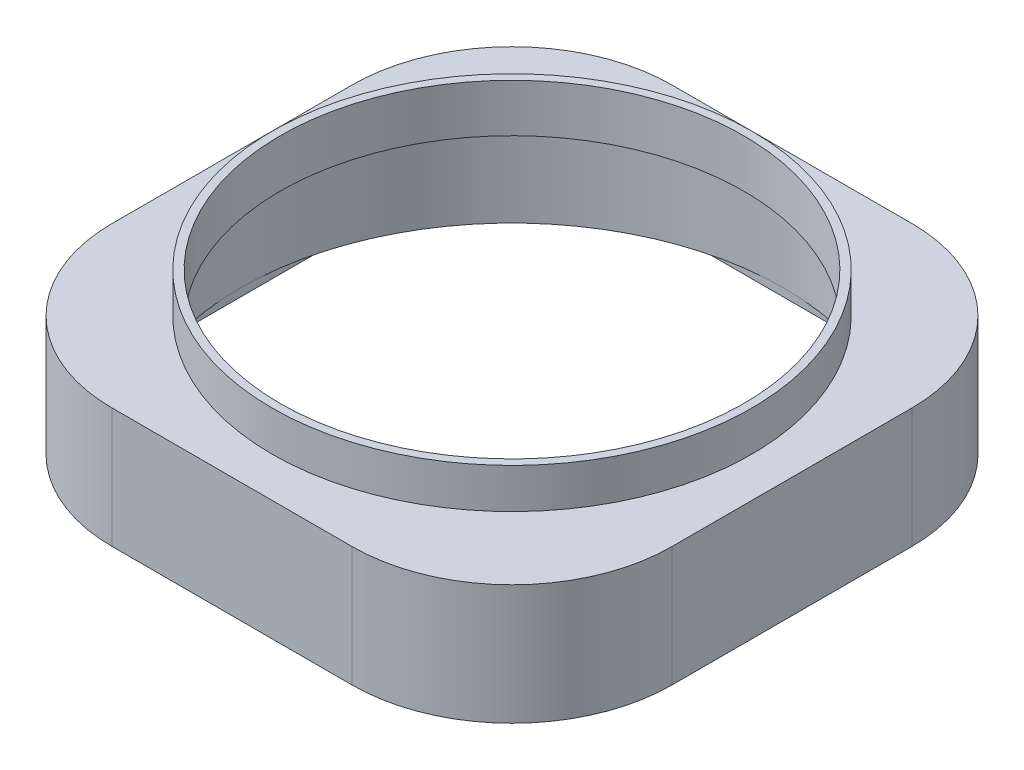
ISO-10303-21;
HEADER;
FILE_DESCRIPTION(('STEP AP214'),'2;1');
FILE_NAME('part.step','',(''),(''),'','','');
FILE_SCHEMA(('AUTOMOTIVE_DESIGN { 1 0 10303 214 1 1 1 1 }'));
ENDSEC;
DATA;
#1=APPLICATION_CONTEXT('core data for automotive mechanical design processes');
#2=APPLICATION_PROTOCOL_DEFINITION('international standard','automotive_design',2000,#1);
#3=PRODUCT_CONTEXT('',#1,'mechanical');
#4=PRODUCT('Part','Part','',(#3));
#5=PRODUCT_RELATED_PRODUCT_CATEGORY('part','',(#4));
#6=PRODUCT_DEFINITION_FORMATION('','',#4);
#7=PRODUCT_DEFINITION_CONTEXT('part definition',#1,'design');
#8=PRODUCT_DEFINITION('design','',#6,#7);
#9=PRODUCT_DEFINITION_SHAPE('','',#8);
#10=(LENGTH_UNIT() NAMED_UNIT(*) SI_UNIT(.MILLI.,.METRE.));
#11=(NAMED_UNIT(*) PLANE_ANGLE_UNIT() SI_UNIT($,.RADIAN.));
#12=(NAMED_UNIT(*) SI_UNIT($,.STERADIAN.) SOLID_ANGLE_UNIT());
#13=UNCERTAINTY_MEASURE_WITH_UNIT(LENGTH_MEASURE(1.E-05),#10,'distance_accuracy_value','');
#14=(GEOMETRIC_REPRESENTATION_CONTEXT(3) GLOBAL_UNCERTAINTY_ASSIGNED_CONTEXT((#13)) GLOBAL_UNIT_ASSIGNED_CONTEXT((#10,
#11,#12)) REPRESENTATION_CONTEXT('',''));
#15=CARTESIAN_POINT('',(0.,0.,0.));
#16=DIRECTION('',(0.,0.,1.));
#17=DIRECTION('',(1.,0.,0.));
#18=AXIS2_PLACEMENT_3D('',#15,#16,#17);
#19=CARTESIAN_POINT('',(0.,-2.00000000000007,0.));
#20=DIRECTION('',(0.,-1.,0.));
#21=DIRECTION('',(0.,0.,-1.));
#22=AXIS2_PLACEMENT_3D('',#19,#20,#21);
#23=CYLINDRICAL_SURFACE('',#22,68.);
#24=CARTESIAN_POINT('',(0.,-2.00000000000007,0.));
#25=DIRECTION('',(0.,-1.,0.));
#26=DIRECTION('',(0.,0.,-1.));
#27=AXIS2_PLACEMENT_3D('',#24,#25,#26);
#28=CIRCLE('',#27,68.);
#29=CARTESIAN_POINT('',(0.,-2.00000000000007,-68.));
#30=VERTEX_POINT('',#29);
#31=EDGE_CURVE('E253',#30,#30,#28,.T.);
#32=ORIENTED_EDGE('',*,*,#31,.F.);
#33=EDGE_LOOP('',(#32));
#34=FACE_BOUND('',#33,.T.);
#35=CARTESIAN_POINT('',(0.,-28.,0.));
#36=DIRECTION('',(0.,-1.,0.));
#37=DIRECTION('',(0.,0.,-1.));
#38=AXIS2_PLACEMENT_3D('',#35,#36,#37);
#39=CIRCLE('',#38,68.);
#40=CARTESIAN_POINT('',(0.,-28.,-67.9999999999997));
#41=VERTEX_POINT('',#40);
#42=CARTESIAN_POINT('',(-67.9999999999999,-28.,7.70679816260629E-13));
#43=VERTEX_POINT('',#42);
#44=EDGE_CURVE('E11',#41,#43,#39,.F.);
#45=ORIENTED_EDGE('',*,*,#44,.F.);
#46=CARTESIAN_POINT('',(67.9999999999999,-28.,-1.25825276124184E-13));
#47=VERTEX_POINT('',#46);
#48=EDGE_CURVE('E37',#47,#41,#39,.F.);
#49=ORIENTED_EDGE('',*,*,#48,.F.);
#50=CARTESIAN_POINT('',(0.,-28.,68.));
#51=VERTEX_POINT('',#50);
#52=EDGE_CURVE('E329',#51,#47,#39,.F.);
#53=ORIENTED_EDGE('',*,*,#52,.F.);
#54=EDGE_CURVE('E42',#43,#51,#39,.F.);
#55=ORIENTED_EDGE('',*,*,#54,.F.);
#56=EDGE_LOOP('',(#45,#49,#53,#55));
#57=FACE_BOUND('',#56,.T.);
#58=ADVANCED_FACE('F33',(#34,#57),#23,.F.);
#59=CARTESIAN_POINT('',(-30.,-40.,30.));
#60=DIRECTION('',(0.,1.,0.));
#61=DIRECTION('',(0.,0.,1.));
#62=AXIS2_PLACEMENT_3D('',#59,#60,#61);
#63=CYLINDRICAL_SURFACE('',#62,40.);
#64=DIRECTION('',(0.,1.,0.));
#65=VECTOR('',#64,1.);
#66=CARTESIAN_POINT('',(-70.,-40.,29.9999999999997));
#67=LINE('',#66,#65);
#68=CARTESIAN_POINT('',(-70.,-30.,29.9999999999997));
#69=VERTEX_POINT('',#68);
#70=CARTESIAN_POINT('',(-70.,0.,29.9999999999997));
#71=VERTEX_POINT('',#70);
#72=EDGE_CURVE('E270',#69,#71,#67,.T.);
#73=ORIENTED_EDGE('',*,*,#72,.F.);
#74=CARTESIAN_POINT('',(-30.,-30.,30.));
#75=DIRECTION('',(0.,-1.,0.));
#76=DIRECTION('',(0.,0.,-1.));
#77=AXIS2_PLACEMENT_3D('',#74,#75,#76);
#78=CIRCLE('',#77,40.);
#79=CARTESIAN_POINT('',(-29.9999999999997,-30.,70.));
#80=VERTEX_POINT('',#79);
#81=EDGE_CURVE('E250',#69,#80,#78,.F.);
#82=ORIENTED_EDGE('',*,*,#81,.T.);
#83=DIRECTION('',(0.,1.,0.));
#84=VECTOR('',#83,1.);
#85=CARTESIAN_POINT('',(-29.9999999999997,-40.,70.));
#86=LINE('',#85,#84);
#87=CARTESIAN_POINT('',(-29.9999999999997,0.,70.));
#88=VERTEX_POINT('',#87);
#89=EDGE_CURVE('E294',#80,#88,#86,.T.);
#90=ORIENTED_EDGE('',*,*,#89,.T.);
#91=CARTESIAN_POINT('',(-30.,0.,30.));
#92=DIRECTION('',(0.,1.,0.));
#93=DIRECTION('',(0.,0.,-1.));
#94=AXIS2_PLACEMENT_3D('',#91,#92,#93);
#95=CIRCLE('',#94,40.);
#96=EDGE_CURVE('E265',#71,#88,#95,.T.);
#97=ORIENTED_EDGE('',*,*,#96,.F.);
#98=EDGE_LOOP('',(#73,#82,#90,#97));
#99=FACE_BOUND('',#98,.T.);
#100=ADVANCED_FACE('F35',(#99),#63,.T.);
#101=CARTESIAN_POINT('',(-70.,-40.,-29.9999999999997));
#102=DIRECTION('',(-1.,0.,0.));
#103=DIRECTION('',(0.,0.,1.));
#104=AXIS2_PLACEMENT_3D('',#101,#102,#103);
#105=PLANE('',#104);
#106=DIRECTION('',(0.,1.,0.));
#107=VECTOR('',#106,1.);
#108=CARTESIAN_POINT('',(-70.,-40.,-29.9999999999997));
#109=LINE('',#108,#107);
#110=CARTESIAN_POINT('',(-70.,-30.,-29.9999999999997));
#111=VERTEX_POINT('',#110);
#112=CARTESIAN_POINT('',(-70.,0.,-29.9999999999997));
#113=VERTEX_POINT('',#112);
#114=EDGE_CURVE('E296',#111,#113,#109,.T.);
#115=ORIENTED_EDGE('',*,*,#114,.F.);
#116=DIRECTION('',(0.,0.,1.));
#117=VECTOR('',#116,1.);
#118=CARTESIAN_POINT('',(-70.,-30.,-29.9999999999997));
#119=LINE('',#118,#117);
#120=EDGE_CURVE('E247',#111,#69,#119,.T.);
#121=ORIENTED_EDGE('',*,*,#120,.T.);
#122=ORIENTED_EDGE('',*,*,#72,.T.);
#123=DIRECTION('',(0.,0.,1.));
#124=VECTOR('',#123,1.);
#125=CARTESIAN_POINT('',(-70.,0.,-29.9999999999997));
#126=LINE('',#125,#124);
#127=EDGE_CURVE('E291',#113,#71,#126,.T.);
#128=ORIENTED_EDGE('',*,*,#127,.F.);
#129=EDGE_LOOP('',(#115,#121,#122,#128));
#130=FACE_BOUND('',#129,.T.);
#131=ADVANCED_FACE('F350',(#130),#105,.T.);
#132=CARTESIAN_POINT('',(-30.,-40.,-30.));
#133=DIRECTION('',(0.,1.,0.));
#134=DIRECTION('',(0.,0.,1.));
#135=AXIS2_PLACEMENT_3D('',#132,#133,#134);
#136=CYLINDRICAL_SURFACE('',#135,40.);
#137=DIRECTION('',(0.,1.,0.));
#138=VECTOR('',#137,1.);
#139=CARTESIAN_POINT('',(-29.9999999999997,-40.,-70.));
#140=LINE('',#139,#138);
#141=CARTESIAN_POINT('',(-29.9999999999997,-30.,-70.));
#142=VERTEX_POINT('',#141);
#143=CARTESIAN_POINT('',(-29.9999999999997,0.,-70.));
#144=VERTEX_POINT('',#143);
#145=EDGE_CURVE('E298',#142,#144,#140,.T.);
#146=ORIENTED_EDGE('',*,*,#145,.F.);
#147=CARTESIAN_POINT('',(-30.,-30.,-30.));
#148=DIRECTION('',(0.,-1.,0.));
#149=DIRECTION('',(0.,0.,-1.));
#150=AXIS2_PLACEMENT_3D('',#147,#148,#149);
#151=CIRCLE('',#150,40.);
#152=EDGE_CURVE('E244',#142,#111,#151,.F.);
#153=ORIENTED_EDGE('',*,*,#152,.T.);
#154=ORIENTED_EDGE('',*,*,#114,.T.);
#155=CARTESIAN_POINT('',(-30.,0.,-30.));
#156=DIRECTION('',(0.,1.,0.));
#157=DIRECTION('',(0.,0.,-1.));
#158=AXIS2_PLACEMENT_3D('',#155,#156,#157);
#159=CIRCLE('',#158,40.);
#160=EDGE_CURVE('E288',#144,#113,#159,.T.);
#161=ORIENTED_EDGE('',*,*,#160,.F.);
#162=EDGE_LOOP('',(#146,#153,#154,#161));
#163=FACE_BOUND('',#162,.T.);
#164=ADVANCED_FACE('F376',(#163),#136,.T.);
#165=CARTESIAN_POINT('',(-29.9999999999997,-40.,-70.));
#166=DIRECTION('',(0.,0.,-1.));
#167=DIRECTION('',(-1.,0.,0.));
#168=AXIS2_PLACEMENT_3D('',#165,#166,#167);
#169=PLANE('',#168);
#170=DIRECTION('',(0.,1.,0.));
#171=VECTOR('',#170,1.);
#172=CARTESIAN_POINT('',(29.9999999999997,-40.,-70.));
#173=LINE('',#172,#171);
#174=CARTESIAN_POINT('',(30.,-30.,-70.));
#175=VERTEX_POINT('',#174);
#176=CARTESIAN_POINT('',(29.9999999999997,0.,-70.));
#177=VERTEX_POINT('',#176);
#178=EDGE_CURVE('E300',#175,#177,#173,.T.);
#179=ORIENTED_EDGE('',*,*,#178,.F.);
#180=DIRECTION('',(-1.,0.,0.));
#181=VECTOR('',#180,1.);
#182=CARTESIAN_POINT('',(-29.9999999999997,-30.,-70.));
#183=LINE('',#182,#181);
#184=EDGE_CURVE('E241',#175,#142,#183,.T.);
#185=ORIENTED_EDGE('',*,*,#184,.T.);
#186=ORIENTED_EDGE('',*,*,#145,.T.);
#187=DIRECTION('',(-1.,0.,0.));
#188=VECTOR('',#187,1.);
#189=CARTESIAN_POINT('',(-29.9999999999997,0.,-70.));
#190=LINE('',#189,#188);
#191=EDGE_CURVE('E285',#177,#144,#190,.T.);
#192=ORIENTED_EDGE('',*,*,#191,.F.);
#193=EDGE_LOOP('',(#179,#185,#186,#192));
#194=FACE_BOUND('',#193,.T.);
#195=ADVANCED_FACE('F380',(#194),#169,.T.);
#196=CARTESIAN_POINT('',(30.,-40.,-30.));
#197=DIRECTION('',(0.,1.,0.));
#198=DIRECTION('',(0.,0.,1.));
#199=AXIS2_PLACEMENT_3D('',#196,#197,#198);
#200=CYLINDRICAL_SURFACE('',#199,40.);
#201=DIRECTION('',(0.,1.,0.));
#202=VECTOR('',#201,1.);
#203=CARTESIAN_POINT('',(70.,-40.,-29.9999999999997));
#204=LINE('',#203,#202);
#205=CARTESIAN_POINT('',(70.,-30.,-29.9999999999997));
#206=VERTEX_POINT('',#205);
#207=CARTESIAN_POINT('',(70.,0.,-29.9999999999997));
#208=VERTEX_POINT('',#207);
#209=EDGE_CURVE('E302',#206,#208,#204,.T.);
#210=ORIENTED_EDGE('',*,*,#209,.F.);
#211=CARTESIAN_POINT('',(30.,-30.,-30.));
#212=DIRECTION('',(0.,-1.,0.));
#213=DIRECTION('',(0.,0.,-1.));
#214=AXIS2_PLACEMENT_3D('',#211,#212,#213);
#215=CIRCLE('',#214,40.);
#216=EDGE_CURVE('E238',#206,#175,#215,.F.);
#217=ORIENTED_EDGE('',*,*,#216,.T.);
#218=ORIENTED_EDGE('',*,*,#178,.T.);
#219=CARTESIAN_POINT('',(30.,0.,-30.));
#220=DIRECTION('',(0.,1.,0.));
#221=DIRECTION('',(0.,0.,1.));
#222=AXIS2_PLACEMENT_3D('',#219,#220,#221);
#223=CIRCLE('',#222,40.);
#224=EDGE_CURVE('E282',#208,#177,#223,.T.);
#225=ORIENTED_EDGE('',*,*,#224,.F.);
#226=EDGE_LOOP('',(#210,#217,#218,#225));
#227=FACE_BOUND('',#226,.T.);
#228=ADVANCED_FACE('F384',(#227),#200,.T.);
#229=CARTESIAN_POINT('',(70.,-40.,-29.9999999999997));
#230=DIRECTION('',(1.,0.,0.));
#231=DIRECTION('',(0.,0.,-1.));
#232=AXIS2_PLACEMENT_3D('',#229,#230,#231);
#233=PLANE('',#232);
#234=DIRECTION('',(0.,1.,0.));
#235=VECTOR('',#234,1.);
#236=CARTESIAN_POINT('',(70.,-40.,29.9999999999997));
#237=LINE('',#236,#235);
#238=CARTESIAN_POINT('',(70.,-30.,29.9999999999997));
#239=VERTEX_POINT('',#238);
#240=CARTESIAN_POINT('',(70.,0.,29.9999999999997));
#241=VERTEX_POINT('',#240);
#242=EDGE_CURVE('E304',#239,#241,#237,.T.);
#243=ORIENTED_EDGE('',*,*,#242,.F.);
#244=DIRECTION('',(0.,0.,-1.));
#245=VECTOR('',#244,1.);
#246=CARTESIAN_POINT('',(70.,-30.,-29.9999999999997));
#247=LINE('',#246,#245);
#248=EDGE_CURVE('E235',#239,#206,#247,.T.);
#249=ORIENTED_EDGE('',*,*,#248,.T.);
#250=ORIENTED_EDGE('',*,*,#209,.T.);
#251=DIRECTION('',(0.,0.,-1.));
#252=VECTOR('',#251,1.);
#253=CARTESIAN_POINT('',(70.,0.,-29.9999999999997));
#254=LINE('',#253,#252);
#255=EDGE_CURVE('E279',#241,#208,#254,.T.);
#256=ORIENTED_EDGE('',*,*,#255,.F.);
#257=EDGE_LOOP('',(#243,#249,#250,#256));
#258=FACE_BOUND('',#257,.T.);
#259=ADVANCED_FACE('F388',(#258),#233,.T.);
#260=CARTESIAN_POINT('',(30.,-40.,30.));
#261=DIRECTION('',(0.,1.,0.));
#262=DIRECTION('',(0.,0.,1.));
#263=AXIS2_PLACEMENT_3D('',#260,#261,#262);
#264=CYLINDRICAL_SURFACE('',#263,40.);
#265=DIRECTION('',(0.,1.,0.));
#266=VECTOR('',#265,1.);
#267=CARTESIAN_POINT('',(29.9999999999997,-40.,70.));
#268=LINE('',#267,#266);
#269=CARTESIAN_POINT('',(29.9999999999997,-30.,70.));
#270=VERTEX_POINT('',#269);
#271=CARTESIAN_POINT('',(29.9999999999997,0.,70.));
#272=VERTEX_POINT('',#271);
#273=EDGE_CURVE('E306',#270,#272,#268,.T.);
#274=ORIENTED_EDGE('',*,*,#273,.F.);
#275=CARTESIAN_POINT('',(30.,-30.,30.));
#276=DIRECTION('',(0.,-1.,0.));
#277=DIRECTION('',(0.,0.,-1.));
#278=AXIS2_PLACEMENT_3D('',#275,#276,#277);
#279=CIRCLE('',#278,40.);
#280=EDGE_CURVE('E57',#270,#239,#279,.F.);
#281=ORIENTED_EDGE('',*,*,#280,.T.);
#282=ORIENTED_EDGE('',*,*,#242,.T.);
#283=CARTESIAN_POINT('',(30.,0.,30.));
#284=DIRECTION('',(0.,1.,0.));
#285=DIRECTION('',(0.,0.,1.));
#286=AXIS2_PLACEMENT_3D('',#283,#284,#285);
#287=CIRCLE('',#286,40.);
#288=EDGE_CURVE('E276',#272,#241,#287,.T.);
#289=ORIENTED_EDGE('',*,*,#288,.F.);
#290=EDGE_LOOP('',(#274,#281,#282,#289));
#291=FACE_BOUND('',#290,.T.);
#292=ADVANCED_FACE('F392',(#291),#264,.T.);
#293=CARTESIAN_POINT('',(-29.9999999999997,-40.,70.));
#294=DIRECTION('',(0.,0.,1.));
#295=DIRECTION('',(1.,0.,0.));
#296=AXIS2_PLACEMENT_3D('',#293,#294,#295);
#297=PLANE('',#296);
#298=ORIENTED_EDGE('',*,*,#89,.F.);
#299=DIRECTION('',(1.,0.,0.));
#300=VECTOR('',#299,1.);
#301=CARTESIAN_POINT('',(-29.9999999999997,-30.,70.));
#302=LINE('',#301,#300);
#303=EDGE_CURVE('E215',#80,#270,#302,.T.);
#304=ORIENTED_EDGE('',*,*,#303,.T.);
#305=ORIENTED_EDGE('',*,*,#273,.T.);
#306=DIRECTION('',(1.,0.,0.));
#307=VECTOR('',#306,1.);
#308=CARTESIAN_POINT('',(-29.9999999999997,0.,70.));
#309=LINE('',#308,#307);
#310=EDGE_CURVE('E273',#88,#272,#309,.T.);
#311=ORIENTED_EDGE('',*,*,#310,.F.);
#312=EDGE_LOOP('',(#298,#304,#305,#311));
#313=FACE_BOUND('',#312,.T.);
#314=ADVANCED_FACE('F372',(#313),#297,.T.);
#315=CARTESIAN_POINT('',(-30.,0.,30.));
#316=DIRECTION('',(0.,-1.,0.));
#317=DIRECTION('',(0.,0.,-1.));
#318=AXIS2_PLACEMENT_3D('',#315,#316,#317);
#319=PLANE('',#318);
#320=CARTESIAN_POINT('',(0.,0.,0.));
#321=DIRECTION('',(0.,1.,0.));
#322=DIRECTION('',(0.,0.,1.));
#323=AXIS2_PLACEMENT_3D('',#320,#321,#322);
#324=CIRCLE('',#323,60.);
#325=CARTESIAN_POINT('',(0.,0.,60.));
#326=VERTEX_POINT('',#325);
#327=EDGE_CURVE('E266',#326,#326,#324,.T.);
#328=ORIENTED_EDGE('',*,*,#327,.F.);
#329=EDGE_LOOP('',(#328));
#330=FACE_BOUND('',#329,.T.);
#331=ORIENTED_EDGE('',*,*,#96,.T.);
#332=ORIENTED_EDGE('',*,*,#310,.T.);
#333=ORIENTED_EDGE('',*,*,#288,.T.);
#334=ORIENTED_EDGE('',*,*,#255,.T.);
#335=ORIENTED_EDGE('',*,*,#224,.T.);
#336=ORIENTED_EDGE('',*,*,#191,.T.);
#337=ORIENTED_EDGE('',*,*,#160,.T.);
#338=ORIENTED_EDGE('',*,*,#127,.T.);
#339=EDGE_LOOP('',(#331,#332,#333,#334,#335,#336,#337,#338));
#340=FACE_BOUND('',#339,.T.);
#341=ADVANCED_FACE('F368',(#330,#340),#319,.F.);
#342=CARTESIAN_POINT('',(0.,9.99999999999997,0.));
#343=DIRECTION('',(0.,-1.,0.));
#344=DIRECTION('',(0.,0.,-1.));
#345=AXIS2_PLACEMENT_3D('',#342,#343,#344);
#346=CYLINDRICAL_SURFACE('',#345,60.);
#347=CARTESIAN_POINT('',(0.,9.99999999999997,0.));
#348=DIRECTION('',(0.,1.,0.));
#349=DIRECTION('',(0.,0.,1.));
#350=AXIS2_PLACEMENT_3D('',#347,#348,#349);
#351=CIRCLE('',#350,60.);
#352=CARTESIAN_POINT('',(0.,9.99999999999997,60.));
#353=VERTEX_POINT('',#352);
#354=EDGE_CURVE('E262',#353,#353,#351,.T.);
#355=ORIENTED_EDGE('',*,*,#354,.F.);
#356=EDGE_LOOP('',(#355));
#357=FACE_BOUND('',#356,.T.);
#358=ORIENTED_EDGE('',*,*,#327,.T.);
#359=EDGE_LOOP('',(#358));
#360=FACE_BOUND('',#359,.T.);
#361=ADVANCED_FACE('F364',(#357,#360),#346,.T.);
#362=CARTESIAN_POINT('',(0.,9.99999999999997,0.));
#363=DIRECTION('',(0.,1.,0.));
#364=DIRECTION('',(0.,0.,1.));
#365=AXIS2_PLACEMENT_3D('',#362,#363,#364);
#366=PLANE('',#365);
#367=CARTESIAN_POINT('',(0.,9.99999999999997,0.));
#368=DIRECTION('',(0.,1.,0.));
#369=DIRECTION('',(0.,0.,1.));
#370=AXIS2_PLACEMENT_3D('',#367,#368,#369);
#371=CIRCLE('',#370,58.);
#372=CARTESIAN_POINT('',(0.,9.99999999999997,58.));
#373=VERTEX_POINT('',#372);
#374=EDGE_CURVE('E259',#373,#373,#371,.T.);
#375=ORIENTED_EDGE('',*,*,#374,.F.);
#376=EDGE_LOOP('',(#375));
#377=FACE_BOUND('',#376,.T.);
#378=ORIENTED_EDGE('',*,*,#354,.T.);
#379=EDGE_LOOP('',(#378));
#380=FACE_BOUND('',#379,.T.);
#381=ADVANCED_FACE('F360',(#377,#380),#366,.T.);
#382=CARTESIAN_POINT('',(0.,-1.99999999999997,0.));
#383=DIRECTION('',(0.,1.,0.));
#384=DIRECTION('',(0.,0.,1.));
#385=AXIS2_PLACEMENT_3D('',#382,#383,#384);
#386=CYLINDRICAL_SURFACE('',#385,58.);
#387=CARTESIAN_POINT('',(0.,-1.99999999999997,0.));
#388=DIRECTION('',(0.,1.,0.));
#389=DIRECTION('',(0.,0.,1.));
#390=AXIS2_PLACEMENT_3D('',#387,#388,#389);
#391=CIRCLE('',#390,58.);
#392=CARTESIAN_POINT('',(0.,-1.99999999999997,58.));
#393=VERTEX_POINT('',#392);
#394=EDGE_CURVE('E256',#393,#393,#391,.T.);
#395=ORIENTED_EDGE('',*,*,#394,.F.);
#396=EDGE_LOOP('',(#395));
#397=FACE_BOUND('',#396,.T.);
#398=ORIENTED_EDGE('',*,*,#374,.T.);
#399=EDGE_LOOP('',(#398));
#400=FACE_BOUND('',#399,.T.);
#401=ADVANCED_FACE('F357',(#397,#400),#386,.F.);
#402=CARTESIAN_POINT('',(0.,-2.00000000000007,0.));
#403=DIRECTION('',(0.,-1.,0.));
#404=DIRECTION('',(0.,0.,-1.));
#405=AXIS2_PLACEMENT_3D('',#402,#403,#404);
#406=PLANE('',#405);
#407=ORIENTED_EDGE('',*,*,#31,.T.);
#408=EDGE_LOOP('',(#407));
#409=FACE_BOUND('',#408,.T.);
#410=ORIENTED_EDGE('',*,*,#394,.T.);
#411=EDGE_LOOP('',(#410));
#412=FACE_BOUND('',#411,.T.);
#413=ADVANCED_FACE('F355',(#409,#412),#406,.T.);
#414=CARTESIAN_POINT('',(0.,-30.,0.));
#415=DIRECTION('',(0.,-1.,0.));
#416=DIRECTION('',(0.,0.,-1.));
#417=AXIS2_PLACEMENT_3D('',#414,#415,#416);
#418=PLANE('',#417);
#419=CARTESIAN_POINT('',(29.9999999999999,-30.,-30.0000000000001));
#420=DIRECTION('',(0.,-1.,0.));
#421=DIRECTION('',(0.,0.,-1.));
#422=AXIS2_PLACEMENT_3D('',#419,#420,#421);
#423=CIRCLE('',#422,37.9999999999998);
#424=CARTESIAN_POINT('',(29.9999999999998,-30.,-67.9999999999999));
#425=VERTEX_POINT('',#424);
#426=CARTESIAN_POINT('',(67.9999999999999,-30.,-30.));
#427=VERTEX_POINT('',#426);
#428=EDGE_CURVE('E185',#425,#427,#423,.T.);
#429=ORIENTED_EDGE('',*,*,#428,.F.);
#430=DIRECTION('',(1.,0.,0.));
#431=VECTOR('',#430,1.);
#432=CARTESIAN_POINT('',(0.,-30.,-67.9999999999997));
#433=LINE('',#432,#431);
#434=CARTESIAN_POINT('',(-30.0000000000002,-30.,-67.9999999999998));
#435=VERTEX_POINT('',#434);
#436=EDGE_CURVE('E313',#435,#425,#433,.T.);
#437=ORIENTED_EDGE('',*,*,#436,.F.);
#438=CARTESIAN_POINT('',(-30.0000000000002,-30.,-29.9999999999998));
#439=DIRECTION('',(0.,-1.,0.));
#440=DIRECTION('',(0.,0.,-1.));
#441=AXIS2_PLACEMENT_3D('',#438,#439,#440);
#442=CIRCLE('',#441,38.);
#443=CARTESIAN_POINT('',(-68.0000000000002,-30.,-29.9999999999995));
#444=VERTEX_POINT('',#443);
#445=EDGE_CURVE('E188',#444,#435,#442,.T.);
#446=ORIENTED_EDGE('',*,*,#445,.F.);
#447=DIRECTION('',(0.,0.,-1.));
#448=VECTOR('',#447,1.);
#449=CARTESIAN_POINT('',(-67.9999999999999,-30.,7.70679816260629E-13));
#450=LINE('',#449,#448);
#451=CARTESIAN_POINT('',(-67.9999999999995,-30.,30.0000000000005));
#452=VERTEX_POINT('',#451);
#453=EDGE_CURVE('E310',#452,#444,#450,.T.);
#454=ORIENTED_EDGE('',*,*,#453,.F.);
#455=CARTESIAN_POINT('',(-29.9999999999997,-30.,30.0000000000003));
#456=DIRECTION('',(0.,-1.,0.));
#457=DIRECTION('',(0.,0.,-1.));
#458=AXIS2_PLACEMENT_3D('',#455,#456,#457);
#459=CIRCLE('',#458,37.9999999999998);
#460=CARTESIAN_POINT('',(-29.9999999999997,-30.,68.0000000000001));
#461=VERTEX_POINT('',#460);
#462=EDGE_CURVE('E208',#461,#452,#459,.T.);
#463=ORIENTED_EDGE('',*,*,#462,.F.);
#464=DIRECTION('',(-1.,0.,0.));
#465=VECTOR('',#464,1.);
#466=CARTESIAN_POINT('',(0.,-30.,68.));
#467=LINE('',#466,#465);
#468=CARTESIAN_POINT('',(29.9999999999997,-30.,68.));
#469=VERTEX_POINT('',#468);
#470=EDGE_CURVE('E269',#469,#461,#467,.T.);
#471=ORIENTED_EDGE('',*,*,#470,.F.);
#472=CARTESIAN_POINT('',(30.,-30.,30.));
#473=DIRECTION('',(0.,-1.,0.));
#474=DIRECTION('',(0.,0.,-1.));
#475=AXIS2_PLACEMENT_3D('',#472,#473,#474);
#476=CIRCLE('',#475,38.);
#477=CARTESIAN_POINT('',(68.,-30.,30.));
#478=VERTEX_POINT('',#477);
#479=EDGE_CURVE('E167',#478,#469,#476,.T.);
#480=ORIENTED_EDGE('',*,*,#479,.F.);
#481=DIRECTION('',(0.,0.,1.));
#482=VECTOR('',#481,1.);
#483=CARTESIAN_POINT('',(67.9999999999999,-30.,-1.25825276124184E-13));
#484=LINE('',#483,#482);
#485=EDGE_CURVE('E312',#427,#478,#484,.T.);
#486=ORIENTED_EDGE('',*,*,#485,.F.);
#487=EDGE_LOOP('',(#429,#437,#446,#454,#463,#471,#480,#486));
#488=FACE_BOUND('',#487,.T.);
#489=ORIENTED_EDGE('',*,*,#120,.F.);
#490=ORIENTED_EDGE('',*,*,#152,.F.);
#491=ORIENTED_EDGE('',*,*,#184,.F.);
#492=ORIENTED_EDGE('',*,*,#216,.F.);
#493=ORIENTED_EDGE('',*,*,#248,.F.);
#494=ORIENTED_EDGE('',*,*,#280,.F.);
#495=ORIENTED_EDGE('',*,*,#303,.F.);
#496=ORIENTED_EDGE('',*,*,#81,.F.);
#497=EDGE_LOOP('',(#489,#490,#491,#492,#493,#494,#495,#496));
#498=FACE_BOUND('',#497,.T.);
#499=ADVANCED_FACE('F318',(#488,#498),#418,.T.);
#500=CARTESIAN_POINT('',(30.,-28.,30.));
#501=DIRECTION('',(0.,-1.,0.));
#502=DIRECTION('',(0.,0.,-1.));
#503=AXIS2_PLACEMENT_3D('',#500,#501,#502);
#504=PLANE('',#503);
#505=ORIENTED_EDGE('',*,*,#44,.T.);
#506=DIRECTION('',(0.,0.,-1.));
#507=VECTOR('',#506,1.);
#508=CARTESIAN_POINT('',(-68.0000000000002,-28.,-29.9999999999995));
#509=LINE('',#508,#507);
#510=CARTESIAN_POINT('',(-68.0000000000002,-28.,-29.9999999999995));
#511=VERTEX_POINT('',#510);
#512=EDGE_CURVE('E193',#43,#511,#509,.T.);
#513=ORIENTED_EDGE('',*,*,#512,.T.);
#514=CARTESIAN_POINT('',(-30.0000000000002,-28.,-29.9999999999998));
#515=DIRECTION('',(0.,-1.,0.));
#516=DIRECTION('',(0.,0.,-1.));
#517=AXIS2_PLACEMENT_3D('',#514,#515,#516);
#518=CIRCLE('',#517,38.);
#519=CARTESIAN_POINT('',(-30.0000000000002,-28.,-67.9999999999998));
#520=VERTEX_POINT('',#519);
#521=EDGE_CURVE('E197',#511,#520,#518,.T.);
#522=ORIENTED_EDGE('',*,*,#521,.T.);
#523=DIRECTION('',(1.,0.,0.));
#524=VECTOR('',#523,1.);
#525=CARTESIAN_POINT('',(29.9999999999998,-28.,-67.9999999999997));
#526=LINE('',#525,#524);
#527=EDGE_CURVE('E201',#520,#41,#526,.T.);
#528=ORIENTED_EDGE('',*,*,#527,.T.);
#529=EDGE_LOOP('',(#505,#513,#522,#528));
#530=FACE_BOUND('',#529,.T.);
#531=ADVANCED_FACE('F339',(#530),#504,.T.);
#532=ORIENTED_EDGE('',*,*,#54,.T.);
#533=DIRECTION('',(-1.,0.,0.));
#534=VECTOR('',#533,1.);
#535=CARTESIAN_POINT('',(-29.9999999999997,-28.,68.));
#536=LINE('',#535,#534);
#537=CARTESIAN_POINT('',(-29.9999999999997,-28.,68.0000000000001));
#538=VERTEX_POINT('',#537);
#539=EDGE_CURVE('E176',#51,#538,#536,.T.);
#540=ORIENTED_EDGE('',*,*,#539,.T.);
#541=CARTESIAN_POINT('',(-29.9999999999997,-28.,30.0000000000003));
#542=DIRECTION('',(0.,-1.,0.));
#543=DIRECTION('',(0.,0.,-1.));
#544=AXIS2_PLACEMENT_3D('',#541,#542,#543);
#545=CIRCLE('',#544,37.9999999999998);
#546=CARTESIAN_POINT('',(-67.9999999999995,-28.,30.0000000000005));
#547=VERTEX_POINT('',#546);
#548=EDGE_CURVE('E180',#538,#547,#545,.T.);
#549=ORIENTED_EDGE('',*,*,#548,.T.);
#550=EDGE_CURVE('E194',#547,#43,#509,.T.);
#551=ORIENTED_EDGE('',*,*,#550,.T.);
#552=EDGE_LOOP('',(#532,#540,#549,#551));
#553=FACE_BOUND('',#552,.T.);
#554=ADVANCED_FACE('F325',(#553),#504,.T.);
#555=ORIENTED_EDGE('',*,*,#52,.T.);
#556=DIRECTION('',(0.,0.,1.));
#557=VECTOR('',#556,1.);
#558=CARTESIAN_POINT('',(68.,-28.,30.));
#559=LINE('',#558,#557);
#560=CARTESIAN_POINT('',(68.,-28.,30.));
#561=VERTEX_POINT('',#560);
#562=EDGE_CURVE('E183',#47,#561,#559,.T.);
#563=ORIENTED_EDGE('',*,*,#562,.T.);
#564=CARTESIAN_POINT('',(30.,-28.,30.));
#565=DIRECTION('',(0.,-1.,0.));
#566=DIRECTION('',(0.,0.,-1.));
#567=AXIS2_PLACEMENT_3D('',#564,#565,#566);
#568=CIRCLE('',#567,38.);
#569=CARTESIAN_POINT('',(29.9999999999997,-28.,68.));
#570=VERTEX_POINT('',#569);
#571=EDGE_CURVE('E165',#561,#570,#568,.T.);
#572=ORIENTED_EDGE('',*,*,#571,.T.);
#573=EDGE_CURVE('E173',#570,#51,#536,.T.);
#574=ORIENTED_EDGE('',*,*,#573,.T.);
#575=EDGE_LOOP('',(#555,#563,#572,#574));
#576=FACE_BOUND('',#575,.T.);
#577=ADVANCED_FACE('F182',(#576),#504,.T.);
#578=ORIENTED_EDGE('',*,*,#48,.T.);
#579=CARTESIAN_POINT('',(29.9999999999998,-28.,-67.9999999999999));
#580=VERTEX_POINT('',#579);
#581=EDGE_CURVE('E200',#41,#580,#526,.T.);
#582=ORIENTED_EDGE('',*,*,#581,.T.);
#583=CARTESIAN_POINT('',(29.9999999999999,-28.,-30.0000000000001));
#584=DIRECTION('',(0.,-1.,0.));
#585=DIRECTION('',(0.,0.,-1.));
#586=AXIS2_PLACEMENT_3D('',#583,#584,#585);
#587=CIRCLE('',#586,37.9999999999998);
#588=CARTESIAN_POINT('',(67.9999999999999,-28.,-30.));
#589=VERTEX_POINT('',#588);
#590=EDGE_CURVE('E204',#580,#589,#587,.T.);
#591=ORIENTED_EDGE('',*,*,#590,.T.);
#592=EDGE_CURVE('E49',#589,#47,#559,.T.);
#593=ORIENTED_EDGE('',*,*,#592,.T.);
#594=EDGE_LOOP('',(#578,#582,#591,#593));
#595=FACE_BOUND('',#594,.T.);
#596=ADVANCED_FACE('F332',(#595),#504,.T.);
#597=CARTESIAN_POINT('',(68.,-28.,30.));
#598=DIRECTION('',(1.,0.,0.));
#599=DIRECTION('',(0.,0.,-1.));
#600=AXIS2_PLACEMENT_3D('',#597,#598,#599);
#601=PLANE('',#600);
#602=ORIENTED_EDGE('',*,*,#485,.T.);
#603=DIRECTION('',(0.,-1.,0.));
#604=VECTOR('',#603,1.);
#605=CARTESIAN_POINT('',(68.,-28.,30.));
#606=LINE('',#605,#604);
#607=EDGE_CURVE('E213',#561,#478,#606,.T.);
#608=ORIENTED_EDGE('',*,*,#607,.F.);
#609=ORIENTED_EDGE('',*,*,#562,.F.);
#610=ORIENTED_EDGE('',*,*,#592,.F.);
#611=DIRECTION('',(0.,-1.,0.));
#612=VECTOR('',#611,1.);
#613=CARTESIAN_POINT('',(67.9999999999999,-28.,-30.));
#614=LINE('',#613,#612);
#615=EDGE_CURVE('E216',#589,#427,#614,.T.);
#616=ORIENTED_EDGE('',*,*,#615,.T.);
#617=EDGE_LOOP('',(#602,#608,#609,#610,#616));
#618=FACE_BOUND('',#617,.T.);
#619=ADVANCED_FACE('F315',(#618),#601,.F.);
#620=CARTESIAN_POINT('',(29.9999999999998,-28.,-67.9999999999997));
#621=DIRECTION('',(0.,0.,-1.));
#622=DIRECTION('',(-1.,0.,0.));
#623=AXIS2_PLACEMENT_3D('',#620,#621,#622);
#624=PLANE('',#623);
#625=ORIENTED_EDGE('',*,*,#436,.T.);
#626=DIRECTION('',(0.,-1.,0.));
#627=VECTOR('',#626,1.);
#628=CARTESIAN_POINT('',(29.9999999999998,-28.,-67.9999999999999));
#629=LINE('',#628,#627);
#630=EDGE_CURVE('E219',#580,#425,#629,.T.);
#631=ORIENTED_EDGE('',*,*,#630,.F.);
#632=ORIENTED_EDGE('',*,*,#581,.F.);
#633=ORIENTED_EDGE('',*,*,#527,.F.);
#634=DIRECTION('',(0.,-1.,0.));
#635=VECTOR('',#634,1.);
#636=CARTESIAN_POINT('',(-30.0000000000002,-28.,-67.9999999999998));
#637=LINE('',#636,#635);
#638=EDGE_CURVE('E222',#520,#435,#637,.T.);
#639=ORIENTED_EDGE('',*,*,#638,.T.);
#640=EDGE_LOOP('',(#625,#631,#632,#633,#639));
#641=FACE_BOUND('',#640,.T.);
#642=ADVANCED_FACE('F336',(#641),#624,.F.);
#643=CARTESIAN_POINT('',(-68.0000000000002,-28.,-29.9999999999995));
#644=DIRECTION('',(-1.,0.,0.));
#645=DIRECTION('',(0.,0.,1.));
#646=AXIS2_PLACEMENT_3D('',#643,#644,#645);
#647=PLANE('',#646);
#648=ORIENTED_EDGE('',*,*,#453,.T.);
#649=DIRECTION('',(0.,-1.,0.));
#650=VECTOR('',#649,1.);
#651=CARTESIAN_POINT('',(-68.0000000000002,-28.,-29.9999999999995));
#652=LINE('',#651,#650);
#653=EDGE_CURVE('E225',#511,#444,#652,.T.);
#654=ORIENTED_EDGE('',*,*,#653,.F.);
#655=ORIENTED_EDGE('',*,*,#512,.F.);
#656=ORIENTED_EDGE('',*,*,#550,.F.);
#657=DIRECTION('',(0.,-1.,0.));
#658=VECTOR('',#657,1.);
#659=CARTESIAN_POINT('',(-67.9999999999995,-28.,30.0000000000005));
#660=LINE('',#659,#658);
#661=EDGE_CURVE('E228',#547,#452,#660,.T.);
#662=ORIENTED_EDGE('',*,*,#661,.T.);
#663=EDGE_LOOP('',(#648,#654,#655,#656,#662));
#664=FACE_BOUND('',#663,.T.);
#665=ADVANCED_FACE('F429',(#664),#647,.F.);
#666=CARTESIAN_POINT('',(-29.9999999999997,-28.,68.));
#667=DIRECTION('',(0.,0.,1.));
#668=DIRECTION('',(1.,0.,0.));
#669=AXIS2_PLACEMENT_3D('',#666,#667,#668);
#670=PLANE('',#669);
#671=ORIENTED_EDGE('',*,*,#470,.T.);
#672=DIRECTION('',(0.,-1.,0.));
#673=VECTOR('',#672,1.);
#674=CARTESIAN_POINT('',(-29.9999999999997,-28.,68.0000000000001));
#675=LINE('',#674,#673);
#676=EDGE_CURVE('E169',#538,#461,#675,.T.);
#677=ORIENTED_EDGE('',*,*,#676,.F.);
#678=ORIENTED_EDGE('',*,*,#539,.F.);
#679=ORIENTED_EDGE('',*,*,#573,.F.);
#680=DIRECTION('',(0.,-1.,0.));
#681=VECTOR('',#680,1.);
#682=CARTESIAN_POINT('',(29.9999999999997,-28.,68.));
#683=LINE('',#682,#681);
#684=EDGE_CURVE('E160',#570,#469,#683,.T.);
#685=ORIENTED_EDGE('',*,*,#684,.T.);
#686=EDGE_LOOP('',(#671,#677,#678,#679,#685));
#687=FACE_BOUND('',#686,.T.);
#688=ADVANCED_FACE('F174',(#687),#670,.F.);
#689=CARTESIAN_POINT('',(30.,-28.,30.));
#690=DIRECTION('',(0.,-1.,0.));
#691=DIRECTION('',(0.,0.,-1.));
#692=AXIS2_PLACEMENT_3D('',#689,#690,#691);
#693=CYLINDRICAL_SURFACE('',#692,38.);
#694=ORIENTED_EDGE('',*,*,#479,.T.);
#695=ORIENTED_EDGE('',*,*,#684,.F.);
#696=ORIENTED_EDGE('',*,*,#571,.F.);
#697=ORIENTED_EDGE('',*,*,#607,.T.);
#698=EDGE_LOOP('',(#694,#695,#696,#697));
#699=FACE_BOUND('',#698,.T.);
#700=ADVANCED_FACE('F162',(#699),#693,.F.);
#701=CARTESIAN_POINT('',(29.9999999999999,-28.,-30.0000000000001));
#702=DIRECTION('',(0.,-1.,0.));
#703=DIRECTION('',(0.,0.,-1.));
#704=AXIS2_PLACEMENT_3D('',#701,#702,#703);
#705=CYLINDRICAL_SURFACE('',#704,37.9999999999998);
#706=ORIENTED_EDGE('',*,*,#428,.T.);
#707=ORIENTED_EDGE('',*,*,#615,.F.);
#708=ORIENTED_EDGE('',*,*,#590,.F.);
#709=ORIENTED_EDGE('',*,*,#630,.T.);
#710=EDGE_LOOP('',(#706,#707,#708,#709));
#711=FACE_BOUND('',#710,.T.);
#712=ADVANCED_FACE('F426',(#711),#705,.F.);
#713=CARTESIAN_POINT('',(-30.0000000000002,-28.,-29.9999999999998));
#714=DIRECTION('',(0.,-1.,0.));
#715=DIRECTION('',(0.,0.,-1.));
#716=AXIS2_PLACEMENT_3D('',#713,#714,#715);
#717=CYLINDRICAL_SURFACE('',#716,38.);
#718=ORIENTED_EDGE('',*,*,#445,.T.);
#719=ORIENTED_EDGE('',*,*,#638,.F.);
#720=ORIENTED_EDGE('',*,*,#521,.F.);
#721=ORIENTED_EDGE('',*,*,#653,.T.);
#722=EDGE_LOOP('',(#718,#719,#720,#721));
#723=FACE_BOUND('',#722,.T.);
#724=ADVANCED_FACE('F432',(#723),#717,.F.);
#725=CARTESIAN_POINT('',(-29.9999999999997,-28.,30.0000000000003));
#726=DIRECTION('',(0.,-1.,0.));
#727=DIRECTION('',(0.,0.,-1.));
#728=AXIS2_PLACEMENT_3D('',#725,#726,#727);
#729=CYLINDRICAL_SURFACE('',#728,37.9999999999998);
#730=ORIENTED_EDGE('',*,*,#462,.T.);
#731=ORIENTED_EDGE('',*,*,#661,.F.);
#732=ORIENTED_EDGE('',*,*,#548,.F.);
#733=ORIENTED_EDGE('',*,*,#676,.T.);
#734=EDGE_LOOP('',(#730,#731,#732,#733));
#735=FACE_BOUND('',#734,.T.);
#736=ADVANCED_FACE('F322',(#735),#729,.F.);
#737=CLOSED_SHELL('',(#58,#100,#131,#164,#195,#228,#259,#292,#314,#341,#361,#381,#401,#413,#499,
#531,#554,#577,#596,#619,#642,#665,#688,#700,#712,#724,#736));
#738=MANIFOLD_SOLID_BREP('B2',#737);
#739=ADVANCED_BREP_SHAPE_REPRESENTATION('',(#18,#738),#14);
#740=SHAPE_DEFINITION_REPRESENTATION(#9,#739);
ENDSEC;
END-ISO-10303-21;
